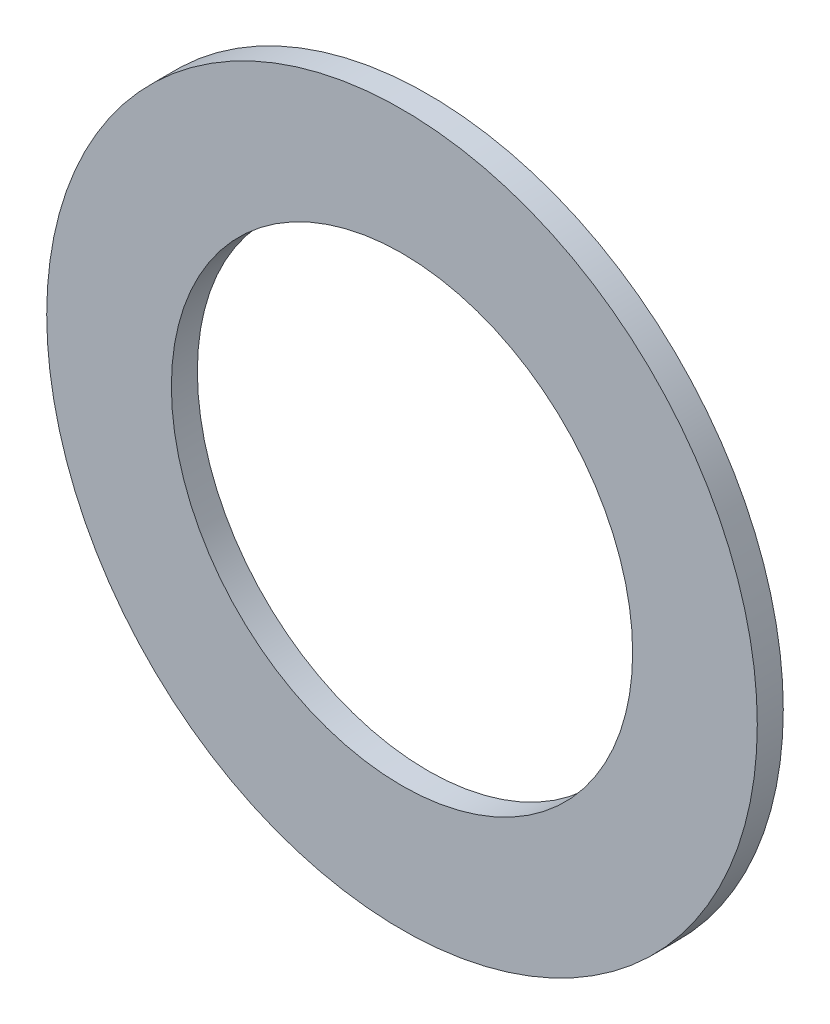
ISO-10303-21;
HEADER;
FILE_DESCRIPTION(('STEP AP214'),'2;1');
FILE_NAME('part.step','',(''),(''),'','','');
FILE_SCHEMA(('AUTOMOTIVE_DESIGN { 1 0 10303 214 1 1 1 1 }'));
ENDSEC;
DATA;
#1=APPLICATION_CONTEXT('core data for automotive mechanical design processes');
#2=APPLICATION_PROTOCOL_DEFINITION('international standard','automotive_design',2000,#1);
#3=PRODUCT_CONTEXT('',#1,'mechanical');
#4=PRODUCT('Part','Part','',(#3));
#5=PRODUCT_RELATED_PRODUCT_CATEGORY('part','',(#4));
#6=PRODUCT_DEFINITION_FORMATION('','',#4);
#7=PRODUCT_DEFINITION_CONTEXT('part definition',#1,'design');
#8=PRODUCT_DEFINITION('design','',#6,#7);
#9=PRODUCT_DEFINITION_SHAPE('','',#8);
#10=(LENGTH_UNIT() NAMED_UNIT(*) SI_UNIT(.MILLI.,.METRE.));
#11=(NAMED_UNIT(*) PLANE_ANGLE_UNIT() SI_UNIT($,.RADIAN.));
#12=(NAMED_UNIT(*) SI_UNIT($,.STERADIAN.) SOLID_ANGLE_UNIT());
#13=UNCERTAINTY_MEASURE_WITH_UNIT(LENGTH_MEASURE(1.E-05),#10,'distance_accuracy_value','');
#14=(GEOMETRIC_REPRESENTATION_CONTEXT(3) GLOBAL_UNCERTAINTY_ASSIGNED_CONTEXT((#13)) GLOBAL_UNIT_ASSIGNED_CONTEXT((#10,
#11,#12)) REPRESENTATION_CONTEXT('',''));
#15=CARTESIAN_POINT('',(0.,0.,0.));
#16=DIRECTION('',(0.,0.,1.));
#17=DIRECTION('',(1.,0.,0.));
#18=AXIS2_PLACEMENT_3D('',#15,#16,#17);
#19=CARTESIAN_POINT('',(0.,0.,0.4064));
#20=DIRECTION('',(0.,0.,1.));
#21=DIRECTION('',(1.,0.,0.));
#22=AXIS2_PLACEMENT_3D('',#19,#20,#21);
#23=PLANE('',#22);
#24=CARTESIAN_POINT('',(0.,0.,0.4064));
#25=DIRECTION('',(0.,0.,1.));
#26=DIRECTION('',(1.,0.,0.));
#27=AXIS2_PLACEMENT_3D('',#24,#25,#26);
#28=CIRCLE('',#27,5.55625);
#29=CARTESIAN_POINT('',(5.55625,0.,0.4064));
#30=VERTEX_POINT('',#29);
#31=EDGE_CURVE('E10',#30,#30,#28,.T.);
#32=ORIENTED_EDGE('',*,*,#31,.T.);
#33=EDGE_LOOP('',(#32));
#34=FACE_BOUND('',#33,.T.);
#35=CARTESIAN_POINT('',(0.,0.,0.4064));
#36=DIRECTION('',(0.,0.,1.));
#37=DIRECTION('',(1.,0.,0.));
#38=AXIS2_PLACEMENT_3D('',#35,#36,#37);
#39=CIRCLE('',#38,3.6068);
#40=CARTESIAN_POINT('',(3.6068,0.,0.4064));
#41=VERTEX_POINT('',#40);
#42=EDGE_CURVE('E43',#41,#41,#39,.T.);
#43=ORIENTED_EDGE('',*,*,#42,.F.);
#44=EDGE_LOOP('',(#43));
#45=FACE_BOUND('',#44,.T.);
#46=ADVANCED_FACE('F32',(#34,#45),#23,.T.);
#47=CARTESIAN_POINT('',(0.,0.,0.));
#48=DIRECTION('',(0.,0.,1.));
#49=DIRECTION('',(1.,0.,0.));
#50=AXIS2_PLACEMENT_3D('',#47,#48,#49);
#51=PLANE('',#50);
#52=CARTESIAN_POINT('',(0.,0.,0.));
#53=DIRECTION('',(0.,0.,1.));
#54=DIRECTION('',(1.,0.,0.));
#55=AXIS2_PLACEMENT_3D('',#52,#53,#54);
#56=CIRCLE('',#55,5.55625);
#57=CARTESIAN_POINT('',(5.55625,0.,0.));
#58=VERTEX_POINT('',#57);
#59=EDGE_CURVE('E36',#58,#58,#56,.T.);
#60=ORIENTED_EDGE('',*,*,#59,.F.);
#61=EDGE_LOOP('',(#60));
#62=FACE_BOUND('',#61,.T.);
#63=CARTESIAN_POINT('',(0.,0.,0.));
#64=DIRECTION('',(0.,0.,1.));
#65=DIRECTION('',(1.,0.,0.));
#66=AXIS2_PLACEMENT_3D('',#63,#64,#65);
#67=CIRCLE('',#66,3.6068);
#68=CARTESIAN_POINT('',(3.6068,0.,0.));
#69=VERTEX_POINT('',#68);
#70=EDGE_CURVE('E45',#69,#69,#67,.T.);
#71=ORIENTED_EDGE('',*,*,#70,.T.);
#72=EDGE_LOOP('',(#71));
#73=FACE_BOUND('',#72,.T.);
#74=ADVANCED_FACE('F55',(#62,#73),#51,.F.);
#75=CARTESIAN_POINT('',(0.,0.,0.4064));
#76=DIRECTION('',(0.,0.,-1.));
#77=DIRECTION('',(-1.,0.,0.));
#78=AXIS2_PLACEMENT_3D('',#75,#76,#77);
#79=CYLINDRICAL_SURFACE('',#78,5.55625);
#80=ORIENTED_EDGE('',*,*,#31,.F.);
#81=EDGE_LOOP('',(#80));
#82=FACE_BOUND('',#81,.T.);
#83=ORIENTED_EDGE('',*,*,#59,.T.);
#84=EDGE_LOOP('',(#83));
#85=FACE_BOUND('',#84,.T.);
#86=ADVANCED_FACE('F34',(#82,#85),#79,.T.);
#87=CARTESIAN_POINT('',(0.,0.,0.4064));
#88=DIRECTION('',(0.,0.,-1.));
#89=DIRECTION('',(-1.,0.,0.));
#90=AXIS2_PLACEMENT_3D('',#87,#88,#89);
#91=CYLINDRICAL_SURFACE('',#90,3.6068);
#92=ORIENTED_EDGE('',*,*,#42,.T.);
#93=EDGE_LOOP('',(#92));
#94=FACE_BOUND('',#93,.T.);
#95=ORIENTED_EDGE('',*,*,#70,.F.);
#96=EDGE_LOOP('',(#95));
#97=FACE_BOUND('',#96,.T.);
#98=ADVANCED_FACE('F51',(#94,#97),#91,.F.);
#99=CLOSED_SHELL('',(#46,#74,#86,#98));
#100=MANIFOLD_SOLID_BREP('B2',#99);
#101=ADVANCED_BREP_SHAPE_REPRESENTATION('',(#18,#100),#14);
#102=SHAPE_DEFINITION_REPRESENTATION(#9,#101);
ENDSEC;
END-ISO-10303-21;
